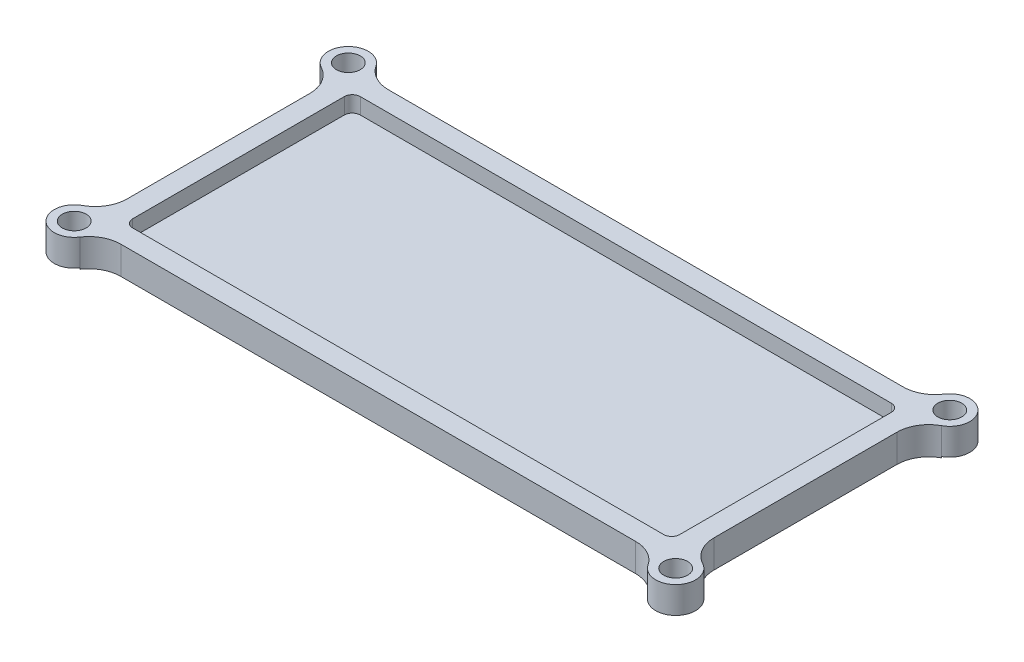
ISO-10303-21;
HEADER;
FILE_DESCRIPTION(('STEP AP214'),'2;1');
FILE_NAME('part.step','',(''),(''),'','','');
FILE_SCHEMA(('AUTOMOTIVE_DESIGN { 1 0 10303 214 1 1 1 1 }'));
ENDSEC;
DATA;
#1=APPLICATION_CONTEXT('core data for automotive mechanical design processes');
#2=APPLICATION_PROTOCOL_DEFINITION('international standard','automotive_design',2000,#1);
#3=PRODUCT_CONTEXT('',#1,'mechanical');
#4=PRODUCT('Part','Part','',(#3));
#5=PRODUCT_RELATED_PRODUCT_CATEGORY('part','',(#4));
#6=PRODUCT_DEFINITION_FORMATION('','',#4);
#7=PRODUCT_DEFINITION_CONTEXT('part definition',#1,'design');
#8=PRODUCT_DEFINITION('design','',#6,#7);
#9=PRODUCT_DEFINITION_SHAPE('','',#8);
#10=(LENGTH_UNIT() NAMED_UNIT(*) SI_UNIT(.MILLI.,.METRE.));
#11=(NAMED_UNIT(*) PLANE_ANGLE_UNIT() SI_UNIT($,.RADIAN.));
#12=(NAMED_UNIT(*) SI_UNIT($,.STERADIAN.) SOLID_ANGLE_UNIT());
#13=UNCERTAINTY_MEASURE_WITH_UNIT(LENGTH_MEASURE(1.E-05),#10,'distance_accuracy_value','');
#14=(GEOMETRIC_REPRESENTATION_CONTEXT(3) GLOBAL_UNCERTAINTY_ASSIGNED_CONTEXT((#13)) GLOBAL_UNIT_ASSIGNED_CONTEXT((#10,
#11,#12)) REPRESENTATION_CONTEXT('',''));
#15=CARTESIAN_POINT('',(0.,0.,0.));
#16=DIRECTION('',(0.,0.,1.));
#17=DIRECTION('',(1.,0.,0.));
#18=AXIS2_PLACEMENT_3D('',#15,#16,#17);
#19=CARTESIAN_POINT('',(0.,0.,0.));
#20=DIRECTION('',(0.,1.,0.));
#21=DIRECTION('',(0.,0.,1.));
#22=AXIS2_PLACEMENT_3D('',#19,#20,#21);
#23=PLANE('',#22);
#24=CARTESIAN_POINT('',(-37.6599420214145,0.,17.1647354791481));
#25=DIRECTION('',(0.,-1.,0.));
#26=DIRECTION('',(0.,0.,-1.));
#27=AXIS2_PLACEMENT_3D('',#24,#25,#26);
#28=CIRCLE('',#27,2.5);
#29=CARTESIAN_POINT('',(-38.848425859332,0.,14.9653023324012));
#30=VERTEX_POINT('',#29);
#31=CARTESIAN_POINT('',(-35.5746356387943,0.,18.5436833717834));
#32=VERTEX_POINT('',#31);
#33=EDGE_CURVE('E230',#30,#32,#28,.T.);
#34=ORIENTED_EDGE('',*,*,#33,.F.);
#35=CARTESIAN_POINT('',(-40.75,0.,11.4462092976062));
#36=DIRECTION('',(0.,1.,0.));
#37=DIRECTION('',(0.,0.,1.));
#38=AXIS2_PLACEMENT_3D('',#35,#36,#37);
#39=CIRCLE('',#38,4.);
#40=CARTESIAN_POINT('',(-36.75,0.,11.4462092976062));
#41=VERTEX_POINT('',#40);
#42=EDGE_CURVE('E290',#30,#41,#39,.T.);
#43=ORIENTED_EDGE('',*,*,#42,.T.);
#44=DIRECTION('',(0.,0.,1.));
#45=VECTOR('',#44,1.);
#46=CARTESIAN_POINT('',(-36.75,0.,0.));
#47=LINE('',#46,#45);
#48=CARTESIAN_POINT('',(-36.75,0.,-11.4462092976062));
#49=VERTEX_POINT('',#48);
#50=EDGE_CURVE('E400',#49,#41,#47,.T.);
#51=ORIENTED_EDGE('',*,*,#50,.F.);
#52=CARTESIAN_POINT('',(-40.75,0.,-11.4462092976062));
#53=DIRECTION('',(0.,1.,0.));
#54=DIRECTION('',(0.,0.,1.));
#55=AXIS2_PLACEMENT_3D('',#52,#53,#54);
#56=CIRCLE('',#55,4.);
#57=CARTESIAN_POINT('',(-38.848425859332,0.,-14.9653023324012));
#58=VERTEX_POINT('',#57);
#59=EDGE_CURVE('E280',#49,#58,#56,.T.);
#60=ORIENTED_EDGE('',*,*,#59,.T.);
#61=CARTESIAN_POINT('',(-37.6599420214145,0.,-17.1647354791481));
#62=DIRECTION('',(0.,-1.,0.));
#63=DIRECTION('',(0.,0.,-1.));
#64=AXIS2_PLACEMENT_3D('',#61,#62,#63);
#65=CIRCLE('',#64,2.5);
#66=CARTESIAN_POINT('',(-35.5746356387943,0.,-18.5436833717834));
#67=VERTEX_POINT('',#66);
#68=EDGE_CURVE('E456',#67,#58,#65,.T.);
#69=ORIENTED_EDGE('',*,*,#68,.F.);
#70=CARTESIAN_POINT('',(-32.2381454266019,0.,-20.75));
#71=DIRECTION('',(0.,1.,0.));
#72=DIRECTION('',(0.,0.,1.));
#73=AXIS2_PLACEMENT_3D('',#70,#71,#72);
#74=CIRCLE('',#73,4.);
#75=CARTESIAN_POINT('',(-32.2381454266019,0.,-16.75));
#76=VERTEX_POINT('',#75);
#77=EDGE_CURVE('E271',#67,#76,#74,.T.);
#78=ORIENTED_EDGE('',*,*,#77,.T.);
#79=DIRECTION('',(-1.,0.,0.));
#80=VECTOR('',#79,1.);
#81=CARTESIAN_POINT('',(0.,0.,-16.75));
#82=LINE('',#81,#80);
#83=CARTESIAN_POINT('',(32.2381454266019,0.,-16.75));
#84=VERTEX_POINT('',#83);
#85=EDGE_CURVE('E397',#84,#76,#82,.T.);
#86=ORIENTED_EDGE('',*,*,#85,.F.);
#87=CARTESIAN_POINT('',(32.2381454266019,0.,-20.75));
#88=DIRECTION('',(0.,1.,0.));
#89=DIRECTION('',(0.,0.,1.));
#90=AXIS2_PLACEMENT_3D('',#87,#88,#89);
#91=CIRCLE('',#90,4.);
#92=CARTESIAN_POINT('',(35.5746356387943,0.,-18.5436833717835));
#93=VERTEX_POINT('',#92);
#94=EDGE_CURVE('E285',#84,#93,#91,.T.);
#95=ORIENTED_EDGE('',*,*,#94,.T.);
#96=CARTESIAN_POINT('',(37.6599420214145,0.,-17.1647354791481));
#97=DIRECTION('',(0.,-1.,0.));
#98=DIRECTION('',(0.,0.,-1.));
#99=AXIS2_PLACEMENT_3D('',#96,#97,#98);
#100=CIRCLE('',#99,2.5);
#101=CARTESIAN_POINT('',(38.848425859332,0.,-14.9653023324012));
#102=VERTEX_POINT('',#101);
#103=EDGE_CURVE('E479',#102,#93,#100,.T.);
#104=ORIENTED_EDGE('',*,*,#103,.F.);
#105=CARTESIAN_POINT('',(40.75,0.,-11.4462092976062));
#106=DIRECTION('',(0.,1.,0.));
#107=DIRECTION('',(0.,0.,1.));
#108=AXIS2_PLACEMENT_3D('',#105,#106,#107);
#109=CIRCLE('',#108,4.);
#110=CARTESIAN_POINT('',(36.75,0.,-11.4462092976062));
#111=VERTEX_POINT('',#110);
#112=EDGE_CURVE('E267',#102,#111,#109,.T.);
#113=ORIENTED_EDGE('',*,*,#112,.T.);
#114=DIRECTION('',(0.,0.,1.));
#115=VECTOR('',#114,1.);
#116=CARTESIAN_POINT('',(36.75,0.,0.));
#117=LINE('',#116,#115);
#118=CARTESIAN_POINT('',(36.75,0.,11.4462092976062));
#119=VERTEX_POINT('',#118);
#120=EDGE_CURVE('E394',#111,#119,#117,.T.);
#121=ORIENTED_EDGE('',*,*,#120,.T.);
#122=CARTESIAN_POINT('',(40.75,0.,11.4462092976062));
#123=DIRECTION('',(0.,1.,0.));
#124=DIRECTION('',(0.,0.,1.));
#125=AXIS2_PLACEMENT_3D('',#122,#123,#124);
#126=CIRCLE('',#125,4.);
#127=CARTESIAN_POINT('',(38.848425859332,0.,14.9653023324012));
#128=VERTEX_POINT('',#127);
#129=EDGE_CURVE('E275',#119,#128,#126,.T.);
#130=ORIENTED_EDGE('',*,*,#129,.T.);
#131=CARTESIAN_POINT('',(37.6599420214145,0.,17.1647354791481));
#132=DIRECTION('',(0.,-1.,0.));
#133=DIRECTION('',(0.,0.,-1.));
#134=AXIS2_PLACEMENT_3D('',#131,#132,#133);
#135=CIRCLE('',#134,2.5);
#136=CARTESIAN_POINT('',(35.5746356387943,0.,18.5436833717835));
#137=VERTEX_POINT('',#136);
#138=EDGE_CURVE('E468',#137,#128,#135,.T.);
#139=ORIENTED_EDGE('',*,*,#138,.F.);
#140=CARTESIAN_POINT('',(32.2381454266019,0.,20.75));
#141=DIRECTION('',(0.,1.,0.));
#142=DIRECTION('',(0.,0.,1.));
#143=AXIS2_PLACEMENT_3D('',#140,#141,#142);
#144=CIRCLE('',#143,4.);
#145=CARTESIAN_POINT('',(32.2381454266019,0.,16.75));
#146=VERTEX_POINT('',#145);
#147=EDGE_CURVE('E294',#137,#146,#144,.T.);
#148=ORIENTED_EDGE('',*,*,#147,.T.);
#149=DIRECTION('',(-1.,0.,0.));
#150=VECTOR('',#149,1.);
#151=CARTESIAN_POINT('',(0.,0.,16.75));
#152=LINE('',#151,#150);
#153=CARTESIAN_POINT('',(-32.2381454266019,0.,16.75));
#154=VERTEX_POINT('',#153);
#155=EDGE_CURVE('E403',#146,#154,#152,.T.);
#156=ORIENTED_EDGE('',*,*,#155,.T.);
#157=CARTESIAN_POINT('',(-32.2381454266019,0.,20.75));
#158=DIRECTION('',(0.,1.,0.));
#159=DIRECTION('',(0.,0.,1.));
#160=AXIS2_PLACEMENT_3D('',#157,#158,#159);
#161=CIRCLE('',#160,4.);
#162=EDGE_CURVE('E298',#154,#32,#161,.T.);
#163=ORIENTED_EDGE('',*,*,#162,.T.);
#164=EDGE_LOOP('',(#34,#43,#51,#60,#69,#78,#86,#95,#104,#113,#121,#130,#139,#148,#156,#163));
#165=FACE_BOUND('',#164,.T.);
#166=ADVANCED_FACE('F40',(#165),#23,.F.);
#167=CARTESIAN_POINT('',(-37.6599420214145,1.5,-17.1647354791481));
#168=DIRECTION('',(0.,-1.,0.));
#169=DIRECTION('',(0.,0.,-1.));
#170=AXIS2_PLACEMENT_3D('',#167,#168,#169);
#171=CYLINDRICAL_SURFACE('',#170,2.5);
#172=CARTESIAN_POINT('',(-37.6599420214145,0.15,-17.1647354791481));
#173=DIRECTION('',(0.,-1.,0.));
#174=DIRECTION('',(0.,0.,-1.));
#175=AXIS2_PLACEMENT_3D('',#172,#173,#174);
#176=CIRCLE('',#175,2.5);
#177=CARTESIAN_POINT('',(-38.848425859332,0.15,-14.9653023324012));
#178=VERTEX_POINT('',#177);
#179=CARTESIAN_POINT('',(-35.5746356387943,0.15,-18.5436833717834));
#180=VERTEX_POINT('',#179);
#181=EDGE_CURVE('E458',#178,#180,#176,.T.);
#182=ORIENTED_EDGE('',*,*,#181,.F.);
#183=DIRECTION('',(0.,-1.,0.));
#184=VECTOR('',#183,1.);
#185=CARTESIAN_POINT('',(-38.848425859332,1.5,-14.9653023324012));
#186=LINE('',#185,#184);
#187=CARTESIAN_POINT('',(-38.848425859332,3.5,-14.9653023324012));
#188=VERTEX_POINT('',#187);
#189=EDGE_CURVE('E418',#178,#188,#186,.F.);
#190=ORIENTED_EDGE('',*,*,#189,.T.);
#191=CARTESIAN_POINT('',(-37.6599420214145,3.5,-17.1647354791481));
#192=DIRECTION('',(0.,1.,0.));
#193=DIRECTION('',(0.,0.,1.));
#194=AXIS2_PLACEMENT_3D('',#191,#192,#193);
#195=CIRCLE('',#194,2.5);
#196=CARTESIAN_POINT('',(-35.5746356387943,3.5,-18.5436833717834));
#197=VERTEX_POINT('',#196);
#198=EDGE_CURVE('E383',#197,#188,#195,.T.);
#199=ORIENTED_EDGE('',*,*,#198,.F.);
#200=DIRECTION('',(0.,-1.,0.));
#201=VECTOR('',#200,1.);
#202=CARTESIAN_POINT('',(-35.5746356387943,1.5,-18.5436833717834));
#203=LINE('',#202,#201);
#204=EDGE_CURVE('E422',#197,#180,#203,.T.);
#205=ORIENTED_EDGE('',*,*,#204,.T.);
#206=EDGE_LOOP('',(#182,#190,#199,#205));
#207=FACE_BOUND('',#206,.T.);
#208=ADVANCED_FACE('F511',(#207),#171,.T.);
#209=CARTESIAN_POINT('',(37.6599420214145,1.5,17.1647354791481));
#210=DIRECTION('',(0.,-1.,0.));
#211=DIRECTION('',(0.,0.,-1.));
#212=AXIS2_PLACEMENT_3D('',#209,#210,#211);
#213=CYLINDRICAL_SURFACE('',#212,2.5);
#214=CARTESIAN_POINT('',(37.6599420214145,0.15,17.1647354791481));
#215=DIRECTION('',(0.,-1.,0.));
#216=DIRECTION('',(0.,0.,-1.));
#217=AXIS2_PLACEMENT_3D('',#214,#215,#216);
#218=CIRCLE('',#217,2.5);
#219=CARTESIAN_POINT('',(38.848425859332,0.15,14.9653023324012));
#220=VERTEX_POINT('',#219);
#221=CARTESIAN_POINT('',(35.5746356387943,0.15,18.5436833717835));
#222=VERTEX_POINT('',#221);
#223=EDGE_CURVE('E471',#220,#222,#218,.T.);
#224=ORIENTED_EDGE('',*,*,#223,.F.);
#225=DIRECTION('',(0.,-1.,0.));
#226=VECTOR('',#225,1.);
#227=CARTESIAN_POINT('',(38.848425859332,1.5,14.9653023324012));
#228=LINE('',#227,#226);
#229=CARTESIAN_POINT('',(38.848425859332,3.5,14.9653023324012));
#230=VERTEX_POINT('',#229);
#231=EDGE_CURVE('E434',#220,#230,#228,.F.);
#232=ORIENTED_EDGE('',*,*,#231,.T.);
#233=CARTESIAN_POINT('',(37.6599420214145,3.5,17.1647354791481));
#234=DIRECTION('',(0.,1.,0.));
#235=DIRECTION('',(0.,0.,1.));
#236=AXIS2_PLACEMENT_3D('',#233,#234,#235);
#237=CIRCLE('',#236,2.5);
#238=CARTESIAN_POINT('',(35.5746356387943,3.5,18.5436833717835));
#239=VERTEX_POINT('',#238);
#240=EDGE_CURVE('E370',#239,#230,#237,.T.);
#241=ORIENTED_EDGE('',*,*,#240,.F.);
#242=DIRECTION('',(0.,-1.,0.));
#243=VECTOR('',#242,1.);
#244=CARTESIAN_POINT('',(35.5746356387943,1.5,18.5436833717835));
#245=LINE('',#244,#243);
#246=EDGE_CURVE('E431',#239,#222,#245,.T.);
#247=ORIENTED_EDGE('',*,*,#246,.T.);
#248=EDGE_LOOP('',(#224,#232,#241,#247));
#249=FACE_BOUND('',#248,.T.);
#250=ADVANCED_FACE('F517',(#249),#213,.T.);
#251=CARTESIAN_POINT('',(36.75,1.5,0.));
#252=DIRECTION('',(1.,0.,0.));
#253=DIRECTION('',(0.,0.,-1.));
#254=AXIS2_PLACEMENT_3D('',#251,#252,#253);
#255=PLANE('',#254);
#256=ORIENTED_EDGE('',*,*,#120,.F.);
#257=DIRECTION('',(0.,1.,0.));
#258=VECTOR('',#257,1.);
#259=CARTESIAN_POINT('',(36.75,3.5,-11.4462092976062));
#260=LINE('',#259,#258);
#261=CARTESIAN_POINT('',(36.75,3.5,-11.4462092976062));
#262=VERTEX_POINT('',#261);
#263=EDGE_CURVE('E416',#111,#262,#260,.T.);
#264=ORIENTED_EDGE('',*,*,#263,.T.);
#265=DIRECTION('',(0.,0.,-1.));
#266=VECTOR('',#265,1.);
#267=CARTESIAN_POINT('',(36.75,3.5,14.8362154518208));
#268=LINE('',#267,#266);
#269=CARTESIAN_POINT('',(36.75,3.5,11.4462092976062));
#270=VERTEX_POINT('',#269);
#271=EDGE_CURVE('E373',#270,#262,#268,.T.);
#272=ORIENTED_EDGE('',*,*,#271,.F.);
#273=DIRECTION('',(0.,-1.,0.));
#274=VECTOR('',#273,1.);
#275=CARTESIAN_POINT('',(36.75,1.5,11.4462092976062));
#276=LINE('',#275,#274);
#277=EDGE_CURVE('E413',#270,#119,#276,.T.);
#278=ORIENTED_EDGE('',*,*,#277,.T.);
#279=EDGE_LOOP('',(#256,#264,#272,#278));
#280=FACE_BOUND('',#279,.T.);
#281=ADVANCED_FACE('F525',(#280),#255,.T.);
#282=CARTESIAN_POINT('',(37.6599420214145,1.5,-17.1647354791481));
#283=DIRECTION('',(0.,-1.,0.));
#284=DIRECTION('',(0.,0.,-1.));
#285=AXIS2_PLACEMENT_3D('',#282,#283,#284);
#286=CYLINDRICAL_SURFACE('',#285,2.5);
#287=CARTESIAN_POINT('',(37.6599420214145,0.15,-17.1647354791481));
#288=DIRECTION('',(0.,-1.,0.));
#289=DIRECTION('',(0.,0.,-1.));
#290=AXIS2_PLACEMENT_3D('',#287,#288,#289);
#291=CIRCLE('',#290,2.5);
#292=CARTESIAN_POINT('',(35.5746356387943,0.15,-18.5436833717835));
#293=VERTEX_POINT('',#292);
#294=CARTESIAN_POINT('',(38.848425859332,0.149999999999999,-14.9653023324012));
#295=VERTEX_POINT('',#294);
#296=EDGE_CURVE('E481',#293,#295,#291,.T.);
#297=ORIENTED_EDGE('',*,*,#296,.F.);
#298=DIRECTION('',(0.,-1.,0.));
#299=VECTOR('',#298,1.);
#300=CARTESIAN_POINT('',(35.5746356387943,1.5,-18.5436833717835));
#301=LINE('',#300,#299);
#302=CARTESIAN_POINT('',(35.5746356387943,3.5,-18.5436833717835));
#303=VERTEX_POINT('',#302);
#304=EDGE_CURVE('E406',#293,#303,#301,.F.);
#305=ORIENTED_EDGE('',*,*,#304,.T.);
#306=CARTESIAN_POINT('',(37.6599420214145,3.5,-17.1647354791481));
#307=DIRECTION('',(0.,1.,0.));
#308=DIRECTION('',(0.,0.,1.));
#309=AXIS2_PLACEMENT_3D('',#306,#307,#308);
#310=CIRCLE('',#309,2.5);
#311=CARTESIAN_POINT('',(38.848425859332,3.5,-14.9653023324012));
#312=VERTEX_POINT('',#311);
#313=EDGE_CURVE('E377',#312,#303,#310,.T.);
#314=ORIENTED_EDGE('',*,*,#313,.F.);
#315=DIRECTION('',(0.,-1.,0.));
#316=VECTOR('',#315,1.);
#317=CARTESIAN_POINT('',(38.848425859332,1.5,-14.9653023324012));
#318=LINE('',#317,#316);
#319=EDGE_CURVE('E410',#312,#295,#318,.T.);
#320=ORIENTED_EDGE('',*,*,#319,.T.);
#321=EDGE_LOOP('',(#297,#305,#314,#320));
#322=FACE_BOUND('',#321,.T.);
#323=ADVANCED_FACE('F537',(#322),#286,.T.);
#324=CARTESIAN_POINT('',(0.,1.5,-16.75));
#325=DIRECTION('',(0.,0.,1.));
#326=DIRECTION('',(1.,0.,0.));
#327=AXIS2_PLACEMENT_3D('',#324,#325,#326);
#328=PLANE('',#327);
#329=ORIENTED_EDGE('',*,*,#85,.T.);
#330=DIRECTION('',(0.,1.,0.));
#331=VECTOR('',#330,1.);
#332=CARTESIAN_POINT('',(-32.2381454266019,3.5,-16.75));
#333=LINE('',#332,#331);
#334=CARTESIAN_POINT('',(-32.238145426602,3.5,-16.75));
#335=VERTEX_POINT('',#334);
#336=EDGE_CURVE('E428',#76,#335,#333,.T.);
#337=ORIENTED_EDGE('',*,*,#336,.T.);
#338=DIRECTION('',(-1.,0.,0.));
#339=VECTOR('',#338,1.);
#340=CARTESIAN_POINT('',(35.1945831261751,3.5,-16.75));
#341=LINE('',#340,#339);
#342=CARTESIAN_POINT('',(32.2381454266019,3.5,-16.75));
#343=VERTEX_POINT('',#342);
#344=EDGE_CURVE('E380',#343,#335,#341,.T.);
#345=ORIENTED_EDGE('',*,*,#344,.F.);
#346=DIRECTION('',(0.,-1.,0.));
#347=VECTOR('',#346,1.);
#348=CARTESIAN_POINT('',(32.2381454266019,1.5,-16.75));
#349=LINE('',#348,#347);
#350=EDGE_CURVE('E425',#343,#84,#349,.T.);
#351=ORIENTED_EDGE('',*,*,#350,.T.);
#352=EDGE_LOOP('',(#329,#337,#345,#351));
#353=FACE_BOUND('',#352,.T.);
#354=ADVANCED_FACE('F533',(#353),#328,.F.);
#355=CARTESIAN_POINT('',(-36.75,1.5,0.));
#356=DIRECTION('',(1.,0.,0.));
#357=DIRECTION('',(0.,0.,-1.));
#358=AXIS2_PLACEMENT_3D('',#355,#356,#357);
#359=PLANE('',#358);
#360=DIRECTION('',(0.,0.,1.));
#361=VECTOR('',#360,1.);
#362=CARTESIAN_POINT('',(-36.75,3.5,-14.8362154518208));
#363=LINE('',#362,#361);
#364=CARTESIAN_POINT('',(-36.75,3.5,-11.4462092976062));
#365=VERTEX_POINT('',#364);
#366=CARTESIAN_POINT('',(-36.75,3.5,11.4462092976062));
#367=VERTEX_POINT('',#366);
#368=EDGE_CURVE('E386',#365,#367,#363,.T.);
#369=ORIENTED_EDGE('',*,*,#368,.F.);
#370=DIRECTION('',(0.,1.,0.));
#371=VECTOR('',#370,1.);
#372=CARTESIAN_POINT('',(-36.75,0.,-11.4462092976062));
#373=LINE('',#372,#371);
#374=EDGE_CURVE('E255',#365,#49,#373,.F.);
#375=ORIENTED_EDGE('',*,*,#374,.T.);
#376=ORIENTED_EDGE('',*,*,#50,.T.);
#377=DIRECTION('',(0.,-1.,0.));
#378=VECTOR('',#377,1.);
#379=CARTESIAN_POINT('',(-36.75,1.5,11.4462092976062));
#380=LINE('',#379,#378);
#381=EDGE_CURVE('E257',#41,#367,#380,.F.);
#382=ORIENTED_EDGE('',*,*,#381,.T.);
#383=EDGE_LOOP('',(#369,#375,#376,#382));
#384=FACE_BOUND('',#383,.T.);
#385=ADVANCED_FACE('F439',(#384),#359,.F.);
#386=CARTESIAN_POINT('',(-37.6599420214145,1.5,17.1647354791481));
#387=DIRECTION('',(0.,-1.,0.));
#388=DIRECTION('',(0.,0.,-1.));
#389=AXIS2_PLACEMENT_3D('',#386,#387,#388);
#390=CYLINDRICAL_SURFACE('',#389,2.5);
#391=CARTESIAN_POINT('',(-37.6599420214145,0.15,17.1647354791481));
#392=DIRECTION('',(0.,-1.,0.));
#393=DIRECTION('',(0.,0.,-1.));
#394=AXIS2_PLACEMENT_3D('',#391,#392,#393);
#395=CIRCLE('',#394,2.5);
#396=CARTESIAN_POINT('',(-35.5746356387943,0.15,18.5436833717834));
#397=VERTEX_POINT('',#396);
#398=CARTESIAN_POINT('',(-38.848425859332,0.15,14.9653023324012));
#399=VERTEX_POINT('',#398);
#400=EDGE_CURVE('E240',#397,#399,#395,.T.);
#401=ORIENTED_EDGE('',*,*,#400,.F.);
#402=DIRECTION('',(0.,-1.,0.));
#403=VECTOR('',#402,1.);
#404=CARTESIAN_POINT('',(-35.5746356387943,1.5,18.5436833717834));
#405=LINE('',#404,#403);
#406=CARTESIAN_POINT('',(-35.5746356387943,3.5,18.5436833717834));
#407=VERTEX_POINT('',#406);
#408=EDGE_CURVE('E235',#397,#407,#405,.F.);
#409=ORIENTED_EDGE('',*,*,#408,.T.);
#410=CARTESIAN_POINT('',(-37.6599420214145,3.5,17.1647354791481));
#411=DIRECTION('',(0.,1.,0.));
#412=DIRECTION('',(0.,0.,1.));
#413=AXIS2_PLACEMENT_3D('',#410,#411,#412);
#414=CIRCLE('',#413,2.5);
#415=CARTESIAN_POINT('',(-38.848425859332,3.5,14.9653023324012));
#416=VERTEX_POINT('',#415);
#417=EDGE_CURVE('E389',#416,#407,#414,.T.);
#418=ORIENTED_EDGE('',*,*,#417,.F.);
#419=DIRECTION('',(0.,-1.,0.));
#420=VECTOR('',#419,1.);
#421=CARTESIAN_POINT('',(-38.848425859332,1.5,14.9653023324012));
#422=LINE('',#421,#420);
#423=EDGE_CURVE('E249',#416,#399,#422,.T.);
#424=ORIENTED_EDGE('',*,*,#423,.T.);
#425=EDGE_LOOP('',(#401,#409,#418,#424));
#426=FACE_BOUND('',#425,.T.);
#427=ADVANCED_FACE('F245',(#426),#390,.T.);
#428=CARTESIAN_POINT('',(0.,1.5,16.75));
#429=DIRECTION('',(0.,0.,1.));
#430=DIRECTION('',(1.,0.,0.));
#431=AXIS2_PLACEMENT_3D('',#428,#429,#430);
#432=PLANE('',#431);
#433=ORIENTED_EDGE('',*,*,#155,.F.);
#434=DIRECTION('',(0.,-1.,0.));
#435=VECTOR('',#434,1.);
#436=CARTESIAN_POINT('',(32.2381454266019,1.5,16.75));
#437=LINE('',#436,#435);
#438=CARTESIAN_POINT('',(32.238145426602,3.5,16.75));
#439=VERTEX_POINT('',#438);
#440=EDGE_CURVE('E265',#146,#439,#437,.F.);
#441=ORIENTED_EDGE('',*,*,#440,.T.);
#442=DIRECTION('',(1.,0.,0.));
#443=VECTOR('',#442,1.);
#444=CARTESIAN_POINT('',(-35.1945831261751,3.5,16.75));
#445=LINE('',#444,#443);
#446=CARTESIAN_POINT('',(-32.2381454266019,3.5,16.75));
#447=VERTEX_POINT('',#446);
#448=EDGE_CURVE('E391',#447,#439,#445,.T.);
#449=ORIENTED_EDGE('',*,*,#448,.F.);
#450=DIRECTION('',(0.,1.,0.));
#451=VECTOR('',#450,1.);
#452=CARTESIAN_POINT('',(-32.2381454266019,0.,16.75));
#453=LINE('',#452,#451);
#454=EDGE_CURVE('E262',#447,#154,#453,.F.);
#455=ORIENTED_EDGE('',*,*,#454,.T.);
#456=EDGE_LOOP('',(#433,#441,#449,#455));
#457=FACE_BOUND('',#456,.T.);
#458=ADVANCED_FACE('F527',(#457),#432,.T.);
#459=CARTESIAN_POINT('',(37.6599420214145,3.5,17.1647354791481));
#460=DIRECTION('',(0.,1.,0.));
#461=DIRECTION('',(0.,0.,1.));
#462=AXIS2_PLACEMENT_3D('',#459,#460,#461);
#463=PLANE('',#462);
#464=CARTESIAN_POINT('',(-37.6599420214145,3.5,17.1647354791481));
#465=DIRECTION('',(0.,-1.,0.));
#466=DIRECTION('',(0.,0.,-1.));
#467=AXIS2_PLACEMENT_3D('',#464,#465,#466);
#468=CIRCLE('',#467,1.5);
#469=CARTESIAN_POINT('',(-37.6599420214145,3.5,15.6647354791481));
#470=VERTEX_POINT('',#469);
#471=EDGE_CURVE('E453',#470,#470,#468,.T.);
#472=ORIENTED_EDGE('',*,*,#471,.T.);
#473=EDGE_LOOP('',(#472));
#474=FACE_BOUND('',#473,.T.);
#475=CARTESIAN_POINT('',(-37.6599420214145,3.5,-17.1647354791481));
#476=DIRECTION('',(0.,-1.,0.));
#477=DIRECTION('',(0.,0.,-1.));
#478=AXIS2_PLACEMENT_3D('',#475,#476,#477);
#479=CIRCLE('',#478,1.5);
#480=CARTESIAN_POINT('',(-37.6599420214145,3.5,-18.6647354791481));
#481=VERTEX_POINT('',#480);
#482=EDGE_CURVE('E465',#481,#481,#479,.T.);
#483=ORIENTED_EDGE('',*,*,#482,.T.);
#484=EDGE_LOOP('',(#483));
#485=FACE_BOUND('',#484,.T.);
#486=CARTESIAN_POINT('',(37.6599420214145,3.5,17.1647354791481));
#487=DIRECTION('',(0.,-1.,0.));
#488=DIRECTION('',(0.,0.,-1.));
#489=AXIS2_PLACEMENT_3D('',#486,#487,#488);
#490=CIRCLE('',#489,1.5);
#491=CARTESIAN_POINT('',(37.6599420214145,3.5,15.6647354791481));
#492=VERTEX_POINT('',#491);
#493=EDGE_CURVE('E476',#492,#492,#490,.T.);
#494=ORIENTED_EDGE('',*,*,#493,.T.);
#495=EDGE_LOOP('',(#494));
#496=FACE_BOUND('',#495,.T.);
#497=CARTESIAN_POINT('',(37.6599420214145,3.5,-17.1647354791481));
#498=DIRECTION('',(0.,-1.,0.));
#499=DIRECTION('',(0.,0.,-1.));
#500=AXIS2_PLACEMENT_3D('',#497,#498,#499);
#501=CIRCLE('',#500,1.5);
#502=CARTESIAN_POINT('',(37.6599420214145,3.5,-18.6647354791481));
#503=VERTEX_POINT('',#502);
#504=EDGE_CURVE('E365',#503,#503,#501,.T.);
#505=ORIENTED_EDGE('',*,*,#504,.T.);
#506=EDGE_LOOP('',(#505));
#507=FACE_BOUND('',#506,.T.);
#508=ORIENTED_EDGE('',*,*,#448,.T.);
#509=CARTESIAN_POINT('',(32.2381454266019,3.5,20.75));
#510=DIRECTION('',(0.,1.,0.));
#511=DIRECTION('',(0.,0.,1.));
#512=AXIS2_PLACEMENT_3D('',#509,#510,#511);
#513=CIRCLE('',#512,4.);
#514=EDGE_CURVE('E296',#439,#239,#513,.F.);
#515=ORIENTED_EDGE('',*,*,#514,.T.);
#516=ORIENTED_EDGE('',*,*,#240,.T.);
#517=CARTESIAN_POINT('',(40.75,3.5,11.4462092976062));
#518=DIRECTION('',(0.,1.,0.));
#519=DIRECTION('',(0.,0.,1.));
#520=AXIS2_PLACEMENT_3D('',#517,#518,#519);
#521=CIRCLE('',#520,4.);
#522=EDGE_CURVE('E278',#230,#270,#521,.F.);
#523=ORIENTED_EDGE('',*,*,#522,.T.);
#524=ORIENTED_EDGE('',*,*,#271,.T.);
#525=CARTESIAN_POINT('',(40.75,3.5,-11.4462092976062));
#526=DIRECTION('',(0.,1.,0.));
#527=DIRECTION('',(0.,0.,1.));
#528=AXIS2_PLACEMENT_3D('',#525,#526,#527);
#529=CIRCLE('',#528,4.);
#530=EDGE_CURVE('E269',#262,#312,#529,.F.);
#531=ORIENTED_EDGE('',*,*,#530,.T.);
#532=ORIENTED_EDGE('',*,*,#313,.T.);
#533=CARTESIAN_POINT('',(32.2381454266019,3.5,-20.75));
#534=DIRECTION('',(0.,1.,0.));
#535=DIRECTION('',(0.,0.,1.));
#536=AXIS2_PLACEMENT_3D('',#533,#534,#535);
#537=CIRCLE('',#536,4.);
#538=EDGE_CURVE('E288',#303,#343,#537,.F.);
#539=ORIENTED_EDGE('',*,*,#538,.T.);
#540=ORIENTED_EDGE('',*,*,#344,.T.);
#541=CARTESIAN_POINT('',(-32.2381454266019,3.5,-20.75));
#542=DIRECTION('',(0.,1.,0.));
#543=DIRECTION('',(0.,0.,1.));
#544=AXIS2_PLACEMENT_3D('',#541,#542,#543);
#545=CIRCLE('',#544,4.);
#546=EDGE_CURVE('E273',#335,#197,#545,.F.);
#547=ORIENTED_EDGE('',*,*,#546,.T.);
#548=ORIENTED_EDGE('',*,*,#198,.T.);
#549=CARTESIAN_POINT('',(-40.75,3.5,-11.4462092976062));
#550=DIRECTION('',(0.,1.,0.));
#551=DIRECTION('',(0.,0.,1.));
#552=AXIS2_PLACEMENT_3D('',#549,#550,#551);
#553=CIRCLE('',#552,4.);
#554=EDGE_CURVE('E283',#188,#365,#553,.F.);
#555=ORIENTED_EDGE('',*,*,#554,.T.);
#556=ORIENTED_EDGE('',*,*,#368,.T.);
#557=CARTESIAN_POINT('',(-40.75,3.5,11.4462092976062));
#558=DIRECTION('',(0.,1.,0.));
#559=DIRECTION('',(0.,0.,1.));
#560=AXIS2_PLACEMENT_3D('',#557,#558,#559);
#561=CIRCLE('',#560,4.);
#562=EDGE_CURVE('E292',#367,#416,#561,.F.);
#563=ORIENTED_EDGE('',*,*,#562,.T.);
#564=ORIENTED_EDGE('',*,*,#417,.T.);
#565=CARTESIAN_POINT('',(-32.2381454266019,3.5,20.75));
#566=DIRECTION('',(0.,1.,0.));
#567=DIRECTION('',(0.,0.,1.));
#568=AXIS2_PLACEMENT_3D('',#565,#566,#567);
#569=CIRCLE('',#568,4.);
#570=EDGE_CURVE('E254',#407,#447,#569,.F.);
#571=ORIENTED_EDGE('',*,*,#570,.T.);
#572=EDGE_LOOP('',(#508,#515,#516,#523,#524,#531,#532,#539,#540,#547,#548,#555,#556,#563,#564,#571));
#573=FACE_BOUND('',#572,.T.);
#574=DIRECTION('',(0.,0.,-1.));
#575=VECTOR('',#574,1.);
#576=CARTESIAN_POINT('',(34.25,3.5,14.25));
#577=LINE('',#576,#575);
#578=CARTESIAN_POINT('',(34.25,3.5,13.25));
#579=VERTEX_POINT('',#578);
#580=CARTESIAN_POINT('',(34.25,3.5,-13.25));
#581=VERTEX_POINT('',#580);
#582=EDGE_CURVE('E339',#579,#581,#577,.T.);
#583=ORIENTED_EDGE('',*,*,#582,.F.);
#584=CARTESIAN_POINT('',(33.25,3.5,13.25));
#585=DIRECTION('',(0.,1.,0.));
#586=DIRECTION('',(0.,0.,1.));
#587=AXIS2_PLACEMENT_3D('',#584,#585,#586);
#588=CIRCLE('',#587,1.);
#589=CARTESIAN_POINT('',(33.25,3.5,14.25));
#590=VERTEX_POINT('',#589);
#591=EDGE_CURVE('E330',#579,#590,#588,.F.);
#592=ORIENTED_EDGE('',*,*,#591,.T.);
#593=DIRECTION('',(1.,0.,0.));
#594=VECTOR('',#593,1.);
#595=CARTESIAN_POINT('',(-34.25,3.5,14.25));
#596=LINE('',#595,#594);
#597=CARTESIAN_POINT('',(-33.25,3.5,14.25));
#598=VERTEX_POINT('',#597);
#599=EDGE_CURVE('E336',#598,#590,#596,.T.);
#600=ORIENTED_EDGE('',*,*,#599,.F.);
#601=CARTESIAN_POINT('',(-33.25,3.5,13.25));
#602=DIRECTION('',(0.,1.,0.));
#603=DIRECTION('',(0.,0.,1.));
#604=AXIS2_PLACEMENT_3D('',#601,#602,#603);
#605=CIRCLE('',#604,1.);
#606=CARTESIAN_POINT('',(-34.25,3.5,13.25));
#607=VERTEX_POINT('',#606);
#608=EDGE_CURVE('E328',#598,#607,#605,.F.);
#609=ORIENTED_EDGE('',*,*,#608,.T.);
#610=DIRECTION('',(0.,0.,1.));
#611=VECTOR('',#610,1.);
#612=CARTESIAN_POINT('',(-34.25,3.5,-14.25));
#613=LINE('',#612,#611);
#614=CARTESIAN_POINT('',(-34.25,3.5,-13.25));
#615=VERTEX_POINT('',#614);
#616=EDGE_CURVE('E374',#615,#607,#613,.T.);
#617=ORIENTED_EDGE('',*,*,#616,.F.);
#618=CARTESIAN_POINT('',(-33.25,3.5,-13.25));
#619=DIRECTION('',(0.,1.,0.));
#620=DIRECTION('',(0.,0.,1.));
#621=AXIS2_PLACEMENT_3D('',#618,#619,#620);
#622=CIRCLE('',#621,1.);
#623=CARTESIAN_POINT('',(-33.25,3.5,-14.25));
#624=VERTEX_POINT('',#623);
#625=EDGE_CURVE('E48',#615,#624,#622,.F.);
#626=ORIENTED_EDGE('',*,*,#625,.T.);
#627=DIRECTION('',(-1.,0.,0.));
#628=VECTOR('',#627,1.);
#629=CARTESIAN_POINT('',(34.25,3.5,-14.25));
#630=LINE('',#629,#628);
#631=CARTESIAN_POINT('',(33.25,3.5,-14.25));
#632=VERTEX_POINT('',#631);
#633=EDGE_CURVE('E491',#632,#624,#630,.T.);
#634=ORIENTED_EDGE('',*,*,#633,.F.);
#635=CARTESIAN_POINT('',(33.25,3.5,-13.25));
#636=DIRECTION('',(0.,1.,0.));
#637=DIRECTION('',(0.,0.,1.));
#638=AXIS2_PLACEMENT_3D('',#635,#636,#637);
#639=CIRCLE('',#638,1.);
#640=EDGE_CURVE('E11',#632,#581,#639,.F.);
#641=ORIENTED_EDGE('',*,*,#640,.T.);
#642=EDGE_LOOP('',(#583,#592,#600,#609,#617,#626,#634,#641));
#643=FACE_BOUND('',#642,.T.);
#644=ADVANCED_FACE('F335',(#474,#485,#496,#507,#573,#643),#463,.T.);
#645=CARTESIAN_POINT('',(-34.25,3.5,14.25));
#646=DIRECTION('',(0.,0.,-1.));
#647=DIRECTION('',(-1.,0.,0.));
#648=AXIS2_PLACEMENT_3D('',#645,#646,#647);
#649=PLANE('',#648);
#650=DIRECTION('',(1.,0.,0.));
#651=VECTOR('',#650,1.);
#652=CARTESIAN_POINT('',(-34.25,1.5,14.25));
#653=LINE('',#652,#651);
#654=CARTESIAN_POINT('',(-33.25,1.5,14.25));
#655=VERTEX_POINT('',#654);
#656=CARTESIAN_POINT('',(33.25,1.5,14.25));
#657=VERTEX_POINT('',#656);
#658=EDGE_CURVE('E357',#655,#657,#653,.T.);
#659=ORIENTED_EDGE('',*,*,#658,.F.);
#660=DIRECTION('',(0.,-1.,0.));
#661=VECTOR('',#660,1.);
#662=CARTESIAN_POINT('',(-33.25,3.5,14.25));
#663=LINE('',#662,#661);
#664=EDGE_CURVE('E317',#655,#598,#663,.F.);
#665=ORIENTED_EDGE('',*,*,#664,.T.);
#666=ORIENTED_EDGE('',*,*,#599,.T.);
#667=DIRECTION('',(0.,-1.,0.));
#668=VECTOR('',#667,1.);
#669=CARTESIAN_POINT('',(33.25,1.5,14.25));
#670=LINE('',#669,#668);
#671=EDGE_CURVE('E314',#590,#657,#670,.T.);
#672=ORIENTED_EDGE('',*,*,#671,.T.);
#673=EDGE_LOOP('',(#659,#665,#666,#672));
#674=FACE_BOUND('',#673,.T.);
#675=ADVANCED_FACE('F345',(#674),#649,.T.);
#676=CARTESIAN_POINT('',(34.25,3.5,14.25));
#677=DIRECTION('',(-1.,0.,0.));
#678=DIRECTION('',(0.,0.,1.));
#679=AXIS2_PLACEMENT_3D('',#676,#677,#678);
#680=PLANE('',#679);
#681=DIRECTION('',(0.,0.,-1.));
#682=VECTOR('',#681,1.);
#683=CARTESIAN_POINT('',(34.25,1.5,14.25));
#684=LINE('',#683,#682);
#685=CARTESIAN_POINT('',(34.25,1.5,13.25));
#686=VERTEX_POINT('',#685);
#687=CARTESIAN_POINT('',(34.25,1.5,-13.25));
#688=VERTEX_POINT('',#687);
#689=EDGE_CURVE('E356',#686,#688,#684,.T.);
#690=ORIENTED_EDGE('',*,*,#689,.F.);
#691=DIRECTION('',(0.,-1.,0.));
#692=VECTOR('',#691,1.);
#693=CARTESIAN_POINT('',(34.25,3.5,13.25));
#694=LINE('',#693,#692);
#695=EDGE_CURVE('E322',#686,#579,#694,.F.);
#696=ORIENTED_EDGE('',*,*,#695,.T.);
#697=ORIENTED_EDGE('',*,*,#582,.T.);
#698=DIRECTION('',(0.,-1.,0.));
#699=VECTOR('',#698,1.);
#700=CARTESIAN_POINT('',(34.25,1.5,-13.25));
#701=LINE('',#700,#699);
#702=EDGE_CURVE('E319',#581,#688,#701,.T.);
#703=ORIENTED_EDGE('',*,*,#702,.T.);
#704=EDGE_LOOP('',(#690,#696,#697,#703));
#705=FACE_BOUND('',#704,.T.);
#706=ADVANCED_FACE('F359',(#705),#680,.T.);
#707=CARTESIAN_POINT('',(34.25,3.5,-14.25));
#708=DIRECTION('',(0.,0.,1.));
#709=DIRECTION('',(1.,0.,0.));
#710=AXIS2_PLACEMENT_3D('',#707,#708,#709);
#711=PLANE('',#710);
#712=ORIENTED_EDGE('',*,*,#633,.T.);
#713=DIRECTION('',(0.,-1.,0.));
#714=VECTOR('',#713,1.);
#715=CARTESIAN_POINT('',(-33.25,1.5,-14.25));
#716=LINE('',#715,#714);
#717=CARTESIAN_POINT('',(-33.25,1.5,-14.25));
#718=VERTEX_POINT('',#717);
#719=EDGE_CURVE('E325',#624,#718,#716,.T.);
#720=ORIENTED_EDGE('',*,*,#719,.T.);
#721=DIRECTION('',(-1.,0.,0.));
#722=VECTOR('',#721,1.);
#723=CARTESIAN_POINT('',(34.25,1.5,-14.25));
#724=LINE('',#723,#722);
#725=CARTESIAN_POINT('',(33.25,1.5,-14.25));
#726=VERTEX_POINT('',#725);
#727=EDGE_CURVE('E361',#726,#718,#724,.T.);
#728=ORIENTED_EDGE('',*,*,#727,.F.);
#729=DIRECTION('',(0.,-1.,0.));
#730=VECTOR('',#729,1.);
#731=CARTESIAN_POINT('',(33.25,3.5,-14.25));
#732=LINE('',#731,#730);
#733=EDGE_CURVE('E61',#726,#632,#732,.F.);
#734=ORIENTED_EDGE('',*,*,#733,.T.);
#735=EDGE_LOOP('',(#712,#720,#728,#734));
#736=FACE_BOUND('',#735,.T.);
#737=ADVANCED_FACE('F503',(#736),#711,.T.);
#738=CARTESIAN_POINT('',(-34.25,3.5,-14.25));
#739=DIRECTION('',(1.,0.,0.));
#740=DIRECTION('',(0.,0.,-1.));
#741=AXIS2_PLACEMENT_3D('',#738,#739,#740);
#742=PLANE('',#741);
#743=ORIENTED_EDGE('',*,*,#616,.T.);
#744=DIRECTION('',(0.,-1.,0.));
#745=VECTOR('',#744,1.);
#746=CARTESIAN_POINT('',(-34.25,1.5,13.25));
#747=LINE('',#746,#745);
#748=CARTESIAN_POINT('',(-34.25,1.5,13.25));
#749=VERTEX_POINT('',#748);
#750=EDGE_CURVE('E303',#607,#749,#747,.T.);
#751=ORIENTED_EDGE('',*,*,#750,.T.);
#752=DIRECTION('',(0.,0.,1.));
#753=VECTOR('',#752,1.);
#754=CARTESIAN_POINT('',(-34.25,1.5,-14.25));
#755=LINE('',#754,#753);
#756=CARTESIAN_POINT('',(-34.25,1.5,-13.25));
#757=VERTEX_POINT('',#756);
#758=EDGE_CURVE('E348',#757,#749,#755,.T.);
#759=ORIENTED_EDGE('',*,*,#758,.F.);
#760=DIRECTION('',(0.,-1.,0.));
#761=VECTOR('',#760,1.);
#762=CARTESIAN_POINT('',(-34.25,3.5,-13.25));
#763=LINE('',#762,#761);
#764=EDGE_CURVE('E301',#757,#615,#763,.F.);
#765=ORIENTED_EDGE('',*,*,#764,.T.);
#766=EDGE_LOOP('',(#743,#751,#759,#765));
#767=FACE_BOUND('',#766,.T.);
#768=ADVANCED_FACE('F495',(#767),#742,.T.);
#769=CARTESIAN_POINT('',(0.,1.5,0.));
#770=DIRECTION('',(0.,1.,0.));
#771=DIRECTION('',(0.,0.,1.));
#772=AXIS2_PLACEMENT_3D('',#769,#770,#771);
#773=PLANE('',#772);
#774=ORIENTED_EDGE('',*,*,#758,.T.);
#775=CARTESIAN_POINT('',(-33.25,1.5,13.25));
#776=DIRECTION('',(0.,1.,0.));
#777=DIRECTION('',(0.,0.,1.));
#778=AXIS2_PLACEMENT_3D('',#775,#776,#777);
#779=CIRCLE('',#778,1.);
#780=EDGE_CURVE('E312',#749,#655,#779,.T.);
#781=ORIENTED_EDGE('',*,*,#780,.T.);
#782=ORIENTED_EDGE('',*,*,#658,.T.);
#783=CARTESIAN_POINT('',(33.25,1.5,13.25));
#784=DIRECTION('',(0.,1.,0.));
#785=DIRECTION('',(0.,0.,1.));
#786=AXIS2_PLACEMENT_3D('',#783,#784,#785);
#787=CIRCLE('',#786,1.);
#788=EDGE_CURVE('E310',#657,#686,#787,.T.);
#789=ORIENTED_EDGE('',*,*,#788,.T.);
#790=ORIENTED_EDGE('',*,*,#689,.T.);
#791=CARTESIAN_POINT('',(33.25,1.5,-13.25));
#792=DIRECTION('',(0.,1.,0.));
#793=DIRECTION('',(0.,0.,1.));
#794=AXIS2_PLACEMENT_3D('',#791,#792,#793);
#795=CIRCLE('',#794,1.);
#796=EDGE_CURVE('E306',#688,#726,#795,.T.);
#797=ORIENTED_EDGE('',*,*,#796,.T.);
#798=ORIENTED_EDGE('',*,*,#727,.T.);
#799=CARTESIAN_POINT('',(-33.25,1.5,-13.25));
#800=DIRECTION('',(0.,1.,0.));
#801=DIRECTION('',(0.,0.,1.));
#802=AXIS2_PLACEMENT_3D('',#799,#800,#801);
#803=CIRCLE('',#802,1.);
#804=EDGE_CURVE('E308',#718,#757,#803,.T.);
#805=ORIENTED_EDGE('',*,*,#804,.T.);
#806=EDGE_LOOP('',(#774,#781,#782,#789,#790,#797,#798,#805));
#807=FACE_BOUND('',#806,.T.);
#808=ADVANCED_FACE('F355',(#807),#773,.T.);
#809=CARTESIAN_POINT('',(40.75,1.5,-11.4462092976062));
#810=DIRECTION('',(0.,-1.,0.));
#811=DIRECTION('',(0.,0.,-1.));
#812=AXIS2_PLACEMENT_3D('',#809,#810,#811);
#813=CYLINDRICAL_SURFACE('',#812,4.);
#814=ORIENTED_EDGE('',*,*,#530,.F.);
#815=ORIENTED_EDGE('',*,*,#263,.F.);
#816=ORIENTED_EDGE('',*,*,#112,.F.);
#817=EDGE_CURVE('E409',#295,#102,#318,.T.);
#818=ORIENTED_EDGE('',*,*,#817,.F.);
#819=ORIENTED_EDGE('',*,*,#319,.F.);
#820=EDGE_LOOP('',(#814,#815,#816,#818,#819));
#821=FACE_BOUND('',#820,.T.);
#822=ADVANCED_FACE('F545',(#821),#813,.F.);
#823=CARTESIAN_POINT('',(-32.2381454266019,1.5,-20.75));
#824=DIRECTION('',(0.,-1.,0.));
#825=DIRECTION('',(0.,0.,-1.));
#826=AXIS2_PLACEMENT_3D('',#823,#824,#825);
#827=CYLINDRICAL_SURFACE('',#826,4.);
#828=ORIENTED_EDGE('',*,*,#546,.F.);
#829=ORIENTED_EDGE('',*,*,#336,.F.);
#830=ORIENTED_EDGE('',*,*,#77,.F.);
#831=EDGE_CURVE('E421',#180,#67,#203,.T.);
#832=ORIENTED_EDGE('',*,*,#831,.F.);
#833=ORIENTED_EDGE('',*,*,#204,.F.);
#834=EDGE_LOOP('',(#828,#829,#830,#832,#833));
#835=FACE_BOUND('',#834,.T.);
#836=ADVANCED_FACE('F548',(#835),#827,.F.);
#837=CARTESIAN_POINT('',(40.75,1.5,11.4462092976062));
#838=DIRECTION('',(0.,-1.,0.));
#839=DIRECTION('',(0.,0.,-1.));
#840=AXIS2_PLACEMENT_3D('',#837,#838,#839);
#841=CYLINDRICAL_SURFACE('',#840,4.);
#842=ORIENTED_EDGE('',*,*,#522,.F.);
#843=ORIENTED_EDGE('',*,*,#231,.F.);
#844=EDGE_CURVE('E435',#128,#220,#228,.F.);
#845=ORIENTED_EDGE('',*,*,#844,.F.);
#846=ORIENTED_EDGE('',*,*,#129,.F.);
#847=ORIENTED_EDGE('',*,*,#277,.F.);
#848=EDGE_LOOP('',(#842,#843,#845,#846,#847));
#849=FACE_BOUND('',#848,.T.);
#850=ADVANCED_FACE('F552',(#849),#841,.F.);
#851=CARTESIAN_POINT('',(-40.75,1.5,-11.4462092976062));
#852=DIRECTION('',(0.,-1.,0.));
#853=DIRECTION('',(0.,0.,-1.));
#854=AXIS2_PLACEMENT_3D('',#851,#852,#853);
#855=CYLINDRICAL_SURFACE('',#854,4.);
#856=ORIENTED_EDGE('',*,*,#554,.F.);
#857=ORIENTED_EDGE('',*,*,#189,.F.);
#858=EDGE_CURVE('E419',#58,#178,#186,.F.);
#859=ORIENTED_EDGE('',*,*,#858,.F.);
#860=ORIENTED_EDGE('',*,*,#59,.F.);
#861=ORIENTED_EDGE('',*,*,#374,.F.);
#862=EDGE_LOOP('',(#856,#857,#859,#860,#861));
#863=FACE_BOUND('',#862,.T.);
#864=ADVANCED_FACE('F556',(#863),#855,.F.);
#865=CARTESIAN_POINT('',(32.2381454266019,1.5,-20.75));
#866=DIRECTION('',(0.,-1.,0.));
#867=DIRECTION('',(0.,0.,-1.));
#868=AXIS2_PLACEMENT_3D('',#865,#866,#867);
#869=CYLINDRICAL_SURFACE('',#868,4.);
#870=ORIENTED_EDGE('',*,*,#538,.F.);
#871=ORIENTED_EDGE('',*,*,#304,.F.);
#872=EDGE_CURVE('E407',#93,#293,#301,.F.);
#873=ORIENTED_EDGE('',*,*,#872,.F.);
#874=ORIENTED_EDGE('',*,*,#94,.F.);
#875=ORIENTED_EDGE('',*,*,#350,.F.);
#876=EDGE_LOOP('',(#870,#871,#873,#874,#875));
#877=FACE_BOUND('',#876,.T.);
#878=ADVANCED_FACE('F560',(#877),#869,.F.);
#879=CARTESIAN_POINT('',(-40.75,1.5,11.4462092976062));
#880=DIRECTION('',(0.,-1.,0.));
#881=DIRECTION('',(0.,0.,-1.));
#882=AXIS2_PLACEMENT_3D('',#879,#880,#881);
#883=CYLINDRICAL_SURFACE('',#882,4.);
#884=ORIENTED_EDGE('',*,*,#562,.F.);
#885=ORIENTED_EDGE('',*,*,#381,.F.);
#886=ORIENTED_EDGE('',*,*,#42,.F.);
#887=EDGE_CURVE('E234',#399,#30,#422,.T.);
#888=ORIENTED_EDGE('',*,*,#887,.F.);
#889=ORIENTED_EDGE('',*,*,#423,.F.);
#890=EDGE_LOOP('',(#884,#885,#886,#888,#889));
#891=FACE_BOUND('',#890,.T.);
#892=ADVANCED_FACE('F447',(#891),#883,.F.);
#893=CARTESIAN_POINT('',(32.2381454266019,1.5,20.75));
#894=DIRECTION('',(0.,-1.,0.));
#895=DIRECTION('',(0.,0.,-1.));
#896=AXIS2_PLACEMENT_3D('',#893,#894,#895);
#897=CYLINDRICAL_SURFACE('',#896,4.);
#898=ORIENTED_EDGE('',*,*,#514,.F.);
#899=ORIENTED_EDGE('',*,*,#440,.F.);
#900=ORIENTED_EDGE('',*,*,#147,.F.);
#901=EDGE_CURVE('E430',#222,#137,#245,.T.);
#902=ORIENTED_EDGE('',*,*,#901,.F.);
#903=ORIENTED_EDGE('',*,*,#246,.F.);
#904=EDGE_LOOP('',(#898,#899,#900,#902,#903));
#905=FACE_BOUND('',#904,.T.);
#906=ADVANCED_FACE('F567',(#905),#897,.F.);
#907=CARTESIAN_POINT('',(-32.2381454266019,1.5,20.75));
#908=DIRECTION('',(0.,-1.,0.));
#909=DIRECTION('',(0.,0.,-1.));
#910=AXIS2_PLACEMENT_3D('',#907,#908,#909);
#911=CYLINDRICAL_SURFACE('',#910,4.);
#912=ORIENTED_EDGE('',*,*,#570,.F.);
#913=ORIENTED_EDGE('',*,*,#408,.F.);
#914=EDGE_CURVE('E224',#32,#397,#405,.F.);
#915=ORIENTED_EDGE('',*,*,#914,.F.);
#916=ORIENTED_EDGE('',*,*,#162,.F.);
#917=ORIENTED_EDGE('',*,*,#454,.F.);
#918=EDGE_LOOP('',(#912,#913,#915,#916,#917));
#919=FACE_BOUND('',#918,.T.);
#920=ADVANCED_FACE('F252',(#919),#911,.F.);
#921=CARTESIAN_POINT('',(37.6599420214145,0.,-17.1647354791481));
#922=DIRECTION('',(0.,-1.,0.));
#923=DIRECTION('',(0.,0.,-1.));
#924=AXIS2_PLACEMENT_3D('',#921,#922,#923);
#925=CYLINDRICAL_SURFACE('',#924,2.5);
#926=EDGE_CURVE('E482',#295,#293,#291,.T.);
#927=ORIENTED_EDGE('',*,*,#926,.F.);
#928=ORIENTED_EDGE('',*,*,#817,.T.);
#929=ORIENTED_EDGE('',*,*,#103,.T.);
#930=ORIENTED_EDGE('',*,*,#872,.T.);
#931=EDGE_LOOP('',(#927,#928,#929,#930));
#932=FACE_BOUND('',#931,.T.);
#933=ADVANCED_FACE('F573',(#932),#925,.F.);
#934=CARTESIAN_POINT('',(37.6599420214145,0.,-17.1647354791481));
#935=DIRECTION('',(0.,-1.,0.));
#936=DIRECTION('',(0.,0.,-1.));
#937=AXIS2_PLACEMENT_3D('',#934,#935,#936);
#938=CYLINDRICAL_SURFACE('',#937,1.5);
#939=ORIENTED_EDGE('',*,*,#504,.F.);
#940=EDGE_LOOP('',(#939));
#941=FACE_BOUND('',#940,.T.);
#942=CARTESIAN_POINT('',(37.6599420214145,1.15,-17.1647354791481));
#943=DIRECTION('',(0.,-1.,0.));
#944=DIRECTION('',(0.,0.,-1.));
#945=AXIS2_PLACEMENT_3D('',#942,#943,#944);
#946=CIRCLE('',#945,1.5);
#947=CARTESIAN_POINT('',(37.6599420214145,1.15,-18.6647354791481));
#948=VERTEX_POINT('',#947);
#949=EDGE_CURVE('E485',#948,#948,#946,.T.);
#950=ORIENTED_EDGE('',*,*,#949,.T.);
#951=EDGE_LOOP('',(#950));
#952=FACE_BOUND('',#951,.T.);
#953=ADVANCED_FACE('F686',(#941,#952),#938,.F.);
#954=CARTESIAN_POINT('',(37.6599420214145,0.15,-17.1647354791481));
#955=DIRECTION('',(0.,-1.,0.));
#956=DIRECTION('',(0.,0.,-1.));
#957=AXIS2_PLACEMENT_3D('',#954,#955,#956);
#958=CONICAL_SURFACE('',#957,2.5,0.785398163397449);
#959=ORIENTED_EDGE('',*,*,#949,.F.);
#960=EDGE_LOOP('',(#959));
#961=FACE_BOUND('',#960,.T.);
#962=ORIENTED_EDGE('',*,*,#926,.T.);
#963=ORIENTED_EDGE('',*,*,#296,.T.);
#964=EDGE_LOOP('',(#962,#963));
#965=FACE_BOUND('',#964,.T.);
#966=ADVANCED_FACE('F677',(#961,#965),#958,.F.);
#967=CARTESIAN_POINT('',(37.6599420214145,0.,17.1647354791481));
#968=DIRECTION('',(0.,-1.,0.));
#969=DIRECTION('',(0.,0.,-1.));
#970=AXIS2_PLACEMENT_3D('',#967,#968,#969);
#971=CYLINDRICAL_SURFACE('',#970,2.5);
#972=EDGE_CURVE('E470',#222,#220,#218,.T.);
#973=ORIENTED_EDGE('',*,*,#972,.F.);
#974=ORIENTED_EDGE('',*,*,#901,.T.);
#975=ORIENTED_EDGE('',*,*,#138,.T.);
#976=ORIENTED_EDGE('',*,*,#844,.T.);
#977=EDGE_LOOP('',(#973,#974,#975,#976));
#978=FACE_BOUND('',#977,.T.);
#979=ADVANCED_FACE('F668',(#978),#971,.F.);
#980=CARTESIAN_POINT('',(37.6599420214145,0.,17.1647354791481));
#981=DIRECTION('',(0.,-1.,0.));
#982=DIRECTION('',(0.,0.,-1.));
#983=AXIS2_PLACEMENT_3D('',#980,#981,#982);
#984=CYLINDRICAL_SURFACE('',#983,1.5);
#985=ORIENTED_EDGE('',*,*,#493,.F.);
#986=EDGE_LOOP('',(#985));
#987=FACE_BOUND('',#986,.T.);
#988=CARTESIAN_POINT('',(37.6599420214145,1.15,17.1647354791481));
#989=DIRECTION('',(0.,-1.,0.));
#990=DIRECTION('',(0.,0.,-1.));
#991=AXIS2_PLACEMENT_3D('',#988,#989,#990);
#992=CIRCLE('',#991,1.5);
#993=CARTESIAN_POINT('',(37.6599420214145,1.15,15.6647354791481));
#994=VERTEX_POINT('',#993);
#995=EDGE_CURVE('E473',#994,#994,#992,.T.);
#996=ORIENTED_EDGE('',*,*,#995,.T.);
#997=EDGE_LOOP('',(#996));
#998=FACE_BOUND('',#997,.T.);
#999=ADVANCED_FACE('F659',(#987,#998),#984,.F.);
#1000=CARTESIAN_POINT('',(37.6599420214145,0.15,17.1647354791481));
#1001=DIRECTION('',(0.,-1.,0.));
#1002=DIRECTION('',(0.,0.,-1.));
#1003=AXIS2_PLACEMENT_3D('',#1000,#1001,#1002);
#1004=CONICAL_SURFACE('',#1003,2.5,0.785398163397449);
#1005=ORIENTED_EDGE('',*,*,#995,.F.);
#1006=EDGE_LOOP('',(#1005));
#1007=FACE_BOUND('',#1006,.T.);
#1008=ORIENTED_EDGE('',*,*,#223,.T.);
#1009=ORIENTED_EDGE('',*,*,#972,.T.);
#1010=EDGE_LOOP('',(#1008,#1009));
#1011=FACE_BOUND('',#1010,.T.);
#1012=ADVANCED_FACE('F650',(#1007,#1011),#1004,.F.);
#1013=CARTESIAN_POINT('',(-37.6599420214145,0.,-17.1647354791481));
#1014=DIRECTION('',(0.,-1.,0.));
#1015=DIRECTION('',(0.,0.,-1.));
#1016=AXIS2_PLACEMENT_3D('',#1013,#1014,#1015);
#1017=CYLINDRICAL_SURFACE('',#1016,1.5);
#1018=ORIENTED_EDGE('',*,*,#482,.F.);
#1019=EDGE_LOOP('',(#1018));
#1020=FACE_BOUND('',#1019,.T.);
#1021=CARTESIAN_POINT('',(-37.6599420214145,1.15,-17.1647354791481));
#1022=DIRECTION('',(0.,-1.,0.));
#1023=DIRECTION('',(0.,0.,-1.));
#1024=AXIS2_PLACEMENT_3D('',#1021,#1022,#1023);
#1025=CIRCLE('',#1024,1.5);
#1026=CARTESIAN_POINT('',(-37.6599420214145,1.15,-18.6647354791481));
#1027=VERTEX_POINT('',#1026);
#1028=EDGE_CURVE('E462',#1027,#1027,#1025,.T.);
#1029=ORIENTED_EDGE('',*,*,#1028,.T.);
#1030=EDGE_LOOP('',(#1029));
#1031=FACE_BOUND('',#1030,.T.);
#1032=ADVANCED_FACE('F641',(#1020,#1031),#1017,.F.);
#1033=CARTESIAN_POINT('',(-37.6599420214145,0.15,-17.1647354791481));
#1034=DIRECTION('',(0.,-1.,0.));
#1035=DIRECTION('',(0.,0.,-1.));
#1036=AXIS2_PLACEMENT_3D('',#1033,#1034,#1035);
#1037=CONICAL_SURFACE('',#1036,2.5,0.785398163397449);
#1038=ORIENTED_EDGE('',*,*,#1028,.F.);
#1039=EDGE_LOOP('',(#1038));
#1040=FACE_BOUND('',#1039,.T.);
#1041=EDGE_CURVE('E459',#180,#178,#176,.T.);
#1042=ORIENTED_EDGE('',*,*,#1041,.T.);
#1043=ORIENTED_EDGE('',*,*,#181,.T.);
#1044=EDGE_LOOP('',(#1042,#1043));
#1045=FACE_BOUND('',#1044,.T.);
#1046=ADVANCED_FACE('F632',(#1040,#1045),#1037,.F.);
#1047=CARTESIAN_POINT('',(-37.6599420214145,0.,-17.1647354791481));
#1048=DIRECTION('',(0.,-1.,0.));
#1049=DIRECTION('',(0.,0.,-1.));
#1050=AXIS2_PLACEMENT_3D('',#1047,#1048,#1049);
#1051=CYLINDRICAL_SURFACE('',#1050,2.5);
#1052=ORIENTED_EDGE('',*,*,#831,.T.);
#1053=ORIENTED_EDGE('',*,*,#68,.T.);
#1054=ORIENTED_EDGE('',*,*,#858,.T.);
#1055=ORIENTED_EDGE('',*,*,#1041,.F.);
#1056=EDGE_LOOP('',(#1052,#1053,#1054,#1055));
#1057=FACE_BOUND('',#1056,.T.);
#1058=ADVANCED_FACE('F623',(#1057),#1051,.F.);
#1059=CARTESIAN_POINT('',(-37.6599420214145,0.,17.1647354791481));
#1060=DIRECTION('',(0.,-1.,0.));
#1061=DIRECTION('',(0.,0.,-1.));
#1062=AXIS2_PLACEMENT_3D('',#1059,#1060,#1061);
#1063=CYLINDRICAL_SURFACE('',#1062,1.5);
#1064=ORIENTED_EDGE('',*,*,#471,.F.);
#1065=EDGE_LOOP('',(#1064));
#1066=FACE_BOUND('',#1065,.T.);
#1067=CARTESIAN_POINT('',(-37.6599420214145,1.15,17.1647354791481));
#1068=DIRECTION('',(0.,-1.,0.));
#1069=DIRECTION('',(0.,0.,-1.));
#1070=AXIS2_PLACEMENT_3D('',#1067,#1068,#1069);
#1071=CIRCLE('',#1070,1.5);
#1072=CARTESIAN_POINT('',(-37.6599420214145,1.15,15.6647354791481));
#1073=VERTEX_POINT('',#1072);
#1074=EDGE_CURVE('E250',#1073,#1073,#1071,.T.);
#1075=ORIENTED_EDGE('',*,*,#1074,.T.);
#1076=EDGE_LOOP('',(#1075));
#1077=FACE_BOUND('',#1076,.T.);
#1078=ADVANCED_FACE('F614',(#1066,#1077),#1063,.F.);
#1079=CARTESIAN_POINT('',(-37.6599420214145,0.15,17.1647354791481));
#1080=DIRECTION('',(0.,-1.,0.));
#1081=DIRECTION('',(0.,0.,-1.));
#1082=AXIS2_PLACEMENT_3D('',#1079,#1080,#1081);
#1083=CONICAL_SURFACE('',#1082,2.5,0.785398163397449);
#1084=ORIENTED_EDGE('',*,*,#1074,.F.);
#1085=EDGE_LOOP('',(#1084));
#1086=FACE_BOUND('',#1085,.T.);
#1087=ORIENTED_EDGE('',*,*,#400,.T.);
#1088=EDGE_CURVE('E227',#399,#397,#395,.T.);
#1089=ORIENTED_EDGE('',*,*,#1088,.T.);
#1090=EDGE_LOOP('',(#1087,#1089));
#1091=FACE_BOUND('',#1090,.T.);
#1092=ADVANCED_FACE('F239',(#1086,#1091),#1083,.F.);
#1093=CARTESIAN_POINT('',(-37.6599420214145,0.,17.1647354791481));
#1094=DIRECTION('',(0.,-1.,0.));
#1095=DIRECTION('',(0.,0.,-1.));
#1096=AXIS2_PLACEMENT_3D('',#1093,#1094,#1095);
#1097=CYLINDRICAL_SURFACE('',#1096,2.5);
#1098=ORIENTED_EDGE('',*,*,#887,.T.);
#1099=ORIENTED_EDGE('',*,*,#33,.T.);
#1100=ORIENTED_EDGE('',*,*,#914,.T.);
#1101=ORIENTED_EDGE('',*,*,#1088,.F.);
#1102=EDGE_LOOP('',(#1098,#1099,#1100,#1101));
#1103=FACE_BOUND('',#1102,.T.);
#1104=ADVANCED_FACE('F226',(#1103),#1097,.F.);
#1105=CARTESIAN_POINT('',(-33.25,3.5,13.25));
#1106=DIRECTION('',(0.,1.,0.));
#1107=DIRECTION('',(0.,0.,1.));
#1108=AXIS2_PLACEMENT_3D('',#1105,#1106,#1107);
#1109=CYLINDRICAL_SURFACE('',#1108,1.);
#1110=ORIENTED_EDGE('',*,*,#608,.F.);
#1111=ORIENTED_EDGE('',*,*,#664,.F.);
#1112=ORIENTED_EDGE('',*,*,#780,.F.);
#1113=ORIENTED_EDGE('',*,*,#750,.F.);
#1114=EDGE_LOOP('',(#1110,#1111,#1112,#1113));
#1115=FACE_BOUND('',#1114,.T.);
#1116=ADVANCED_FACE('F499',(#1115),#1109,.F.);
#1117=CARTESIAN_POINT('',(33.25,3.5,13.25));
#1118=DIRECTION('',(0.,1.,0.));
#1119=DIRECTION('',(0.,0.,1.));
#1120=AXIS2_PLACEMENT_3D('',#1117,#1118,#1119);
#1121=CYLINDRICAL_SURFACE('',#1120,1.);
#1122=ORIENTED_EDGE('',*,*,#591,.F.);
#1123=ORIENTED_EDGE('',*,*,#695,.F.);
#1124=ORIENTED_EDGE('',*,*,#788,.F.);
#1125=ORIENTED_EDGE('',*,*,#671,.F.);
#1126=EDGE_LOOP('',(#1122,#1123,#1124,#1125));
#1127=FACE_BOUND('',#1126,.T.);
#1128=ADVANCED_FACE('F350',(#1127),#1121,.F.);
#1129=CARTESIAN_POINT('',(-33.25,3.5,-13.25));
#1130=DIRECTION('',(0.,1.,0.));
#1131=DIRECTION('',(0.,0.,1.));
#1132=AXIS2_PLACEMENT_3D('',#1129,#1130,#1131);
#1133=CYLINDRICAL_SURFACE('',#1132,1.);
#1134=ORIENTED_EDGE('',*,*,#625,.F.);
#1135=ORIENTED_EDGE('',*,*,#764,.F.);
#1136=ORIENTED_EDGE('',*,*,#804,.F.);
#1137=ORIENTED_EDGE('',*,*,#719,.F.);
#1138=EDGE_LOOP('',(#1134,#1135,#1136,#1137));
#1139=FACE_BOUND('',#1138,.T.);
#1140=ADVANCED_FACE('F501',(#1139),#1133,.F.);
#1141=CARTESIAN_POINT('',(33.25,3.5,-13.25));
#1142=DIRECTION('',(0.,1.,0.));
#1143=DIRECTION('',(0.,0.,1.));
#1144=AXIS2_PLACEMENT_3D('',#1141,#1142,#1143);
#1145=CYLINDRICAL_SURFACE('',#1144,1.);
#1146=ORIENTED_EDGE('',*,*,#640,.F.);
#1147=ORIENTED_EDGE('',*,*,#733,.F.);
#1148=ORIENTED_EDGE('',*,*,#796,.F.);
#1149=ORIENTED_EDGE('',*,*,#702,.F.);
#1150=EDGE_LOOP('',(#1146,#1147,#1148,#1149));
#1151=FACE_BOUND('',#1150,.T.);
#1152=ADVANCED_FACE('F42',(#1151),#1145,.F.);
#1153=CLOSED_SHELL('',(#166,#208,#250,#281,#323,#354,#385,#427,#458,#644,#675,#706,#737,#768,
#808,#822,#836,#850,#864,#878,#892,#906,#920,#933,#953,#966,#979,#999,#1012,#1032,#1046,#1058,
#1078,#1092,#1104,#1116,#1128,#1140,#1152));
#1154=MANIFOLD_SOLID_BREP('B2',#1153);
#1155=ADVANCED_BREP_SHAPE_REPRESENTATION('',(#18,#1154),#14);
#1156=SHAPE_DEFINITION_REPRESENTATION(#9,#1155);
ENDSEC;
END-ISO-10303-21;
